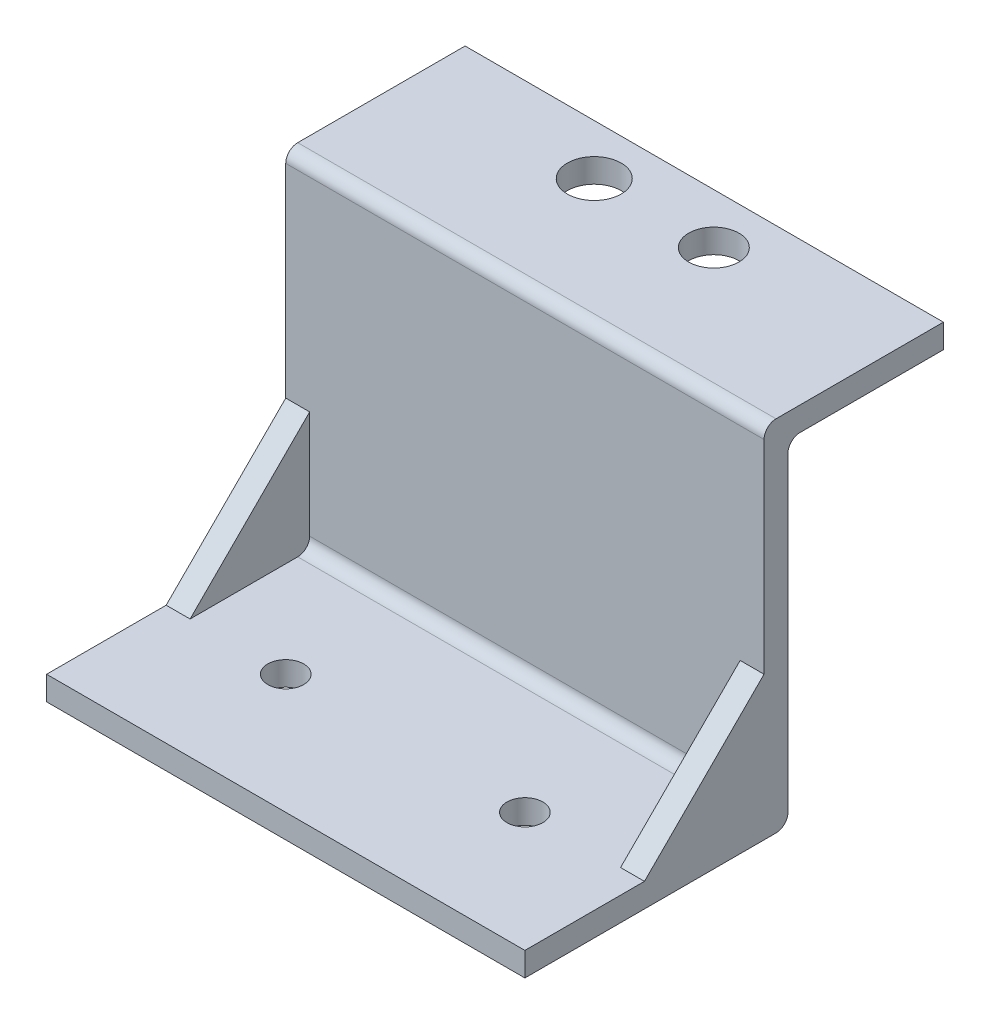
ISO-10303-21;
HEADER;
FILE_DESCRIPTION(('STEP AP214'),'2;1');
FILE_NAME('part.step','',(''),(''),'','','');
FILE_SCHEMA(('AUTOMOTIVE_DESIGN { 1 0 10303 214 1 1 1 1 }'));
ENDSEC;
DATA;
#1=APPLICATION_CONTEXT('core data for automotive mechanical design processes');
#2=APPLICATION_PROTOCOL_DEFINITION('international standard','automotive_design',2000,#1);
#3=PRODUCT_CONTEXT('',#1,'mechanical');
#4=PRODUCT('Part','Part','',(#3));
#5=PRODUCT_RELATED_PRODUCT_CATEGORY('part','',(#4));
#6=PRODUCT_DEFINITION_FORMATION('','',#4);
#7=PRODUCT_DEFINITION_CONTEXT('part definition',#1,'design');
#8=PRODUCT_DEFINITION('design','',#6,#7);
#9=PRODUCT_DEFINITION_SHAPE('','',#8);
#10=(LENGTH_UNIT() NAMED_UNIT(*) SI_UNIT(.MILLI.,.METRE.));
#11=(NAMED_UNIT(*) PLANE_ANGLE_UNIT() SI_UNIT($,.RADIAN.));
#12=(NAMED_UNIT(*) SI_UNIT($,.STERADIAN.) SOLID_ANGLE_UNIT());
#13=UNCERTAINTY_MEASURE_WITH_UNIT(LENGTH_MEASURE(1.E-05),#10,'distance_accuracy_value','');
#14=(GEOMETRIC_REPRESENTATION_CONTEXT(3) GLOBAL_UNCERTAINTY_ASSIGNED_CONTEXT((#13)) GLOBAL_UNIT_ASSIGNED_CONTEXT((#10,
#11,#12)) REPRESENTATION_CONTEXT('',''));
#15=CARTESIAN_POINT('',(0.,0.,0.));
#16=DIRECTION('',(0.,0.,1.));
#17=DIRECTION('',(1.,0.,0.));
#18=AXIS2_PLACEMENT_3D('',#15,#16,#17);
#19=CARTESIAN_POINT('',(0.,-2.,0.));
#20=DIRECTION('',(0.,0.,1.));
#21=DIRECTION('',(1.,0.,0.));
#22=AXIS2_PLACEMENT_3D('',#19,#20,#21);
#23=PLANE('',#22);
#24=DIRECTION('',(1.,0.,0.));
#25=VECTOR('',#24,1.);
#26=CARTESIAN_POINT('',(38.,-18.,0.));
#27=LINE('',#26,#25);
#28=CARTESIAN_POINT('',(38.,-18.,0.));
#29=VERTEX_POINT('',#28);
#30=CARTESIAN_POINT('',(40.,-18.,0.));
#31=VERTEX_POINT('',#30);
#32=EDGE_CURVE('E467',#29,#31,#27,.T.);
#33=ORIENTED_EDGE('',*,*,#32,.T.);
#34=DIRECTION('',(0.,1.,0.));
#35=VECTOR('',#34,1.);
#36=CARTESIAN_POINT('',(40.,-2.,0.));
#37=LINE('',#36,#35);
#38=CARTESIAN_POINT('',(40.,-1.,0.));
#39=VERTEX_POINT('',#38);
#40=EDGE_CURVE('E265',#31,#39,#37,.T.);
#41=ORIENTED_EDGE('',*,*,#40,.T.);
#42=DIRECTION('',(1.,0.,0.));
#43=VECTOR('',#42,1.);
#44=CARTESIAN_POINT('',(0.,-1.,0.));
#45=LINE('',#44,#43);
#46=CARTESIAN_POINT('',(0.,-1.,0.));
#47=VERTEX_POINT('',#46);
#48=EDGE_CURVE('E178',#39,#47,#45,.F.);
#49=ORIENTED_EDGE('',*,*,#48,.T.);
#50=DIRECTION('',(0.,1.,0.));
#51=VECTOR('',#50,1.);
#52=CARTESIAN_POINT('',(0.,-2.,0.));
#53=LINE('',#52,#51);
#54=CARTESIAN_POINT('',(0.,-18.,0.));
#55=VERTEX_POINT('',#54);
#56=EDGE_CURVE('E187',#55,#47,#53,.T.);
#57=ORIENTED_EDGE('',*,*,#56,.F.);
#58=DIRECTION('',(-1.,0.,0.));
#59=VECTOR('',#58,1.);
#60=CARTESIAN_POINT('',(2.,-18.,0.));
#61=LINE('',#60,#59);
#62=CARTESIAN_POINT('',(2.,-18.,0.));
#63=VERTEX_POINT('',#62);
#64=EDGE_CURVE('E485',#63,#55,#61,.T.);
#65=ORIENTED_EDGE('',*,*,#64,.F.);
#66=DIRECTION('',(0.,1.,0.));
#67=VECTOR('',#66,1.);
#68=CARTESIAN_POINT('',(2.,0.,0.));
#69=LINE('',#68,#67);
#70=CARTESIAN_POINT('',(2.,-27.,0.));
#71=VERTEX_POINT('',#70);
#72=EDGE_CURVE('E475',#71,#63,#69,.T.);
#73=ORIENTED_EDGE('',*,*,#72,.F.);
#74=DIRECTION('',(-1.,0.,0.));
#75=VECTOR('',#74,1.);
#76=CARTESIAN_POINT('',(0.,-27.,0.));
#77=LINE('',#76,#75);
#78=CARTESIAN_POINT('',(38.,-27.,0.));
#79=VERTEX_POINT('',#78);
#80=EDGE_CURVE('E182',#71,#79,#77,.F.);
#81=ORIENTED_EDGE('',*,*,#80,.T.);
#82=DIRECTION('',(0.,1.,0.));
#83=VECTOR('',#82,1.);
#84=CARTESIAN_POINT('',(38.,0.,0.));
#85=LINE('',#84,#83);
#86=EDGE_CURVE('E158',#79,#29,#85,.T.);
#87=ORIENTED_EDGE('',*,*,#86,.T.);
#88=EDGE_LOOP('',(#33,#41,#49,#57,#65,#73,#81,#87));
#89=FACE_BOUND('',#88,.T.);
#90=ADVANCED_FACE('F37',(#89),#23,.T.);
#91=CARTESIAN_POINT('',(40.,-28.,20.));
#92=DIRECTION('',(0.,-1.,0.));
#93=DIRECTION('',(1.,0.,0.));
#94=AXIS2_PLACEMENT_3D('',#91,#92,#93);
#95=PLANE('',#94);
#96=CARTESIAN_POINT('',(30.,-28.,10.));
#97=DIRECTION('',(0.,1.,0.));
#98=DIRECTION('',(-1.,0.,0.));
#99=AXIS2_PLACEMENT_3D('',#96,#97,#98);
#100=CIRCLE('',#99,1.5);
#101=CARTESIAN_POINT('',(28.5,-28.,10.));
#102=VERTEX_POINT('',#101);
#103=EDGE_CURVE('E487',#102,#102,#100,.T.);
#104=ORIENTED_EDGE('',*,*,#103,.F.);
#105=EDGE_LOOP('',(#104));
#106=FACE_BOUND('',#105,.T.);
#107=CARTESIAN_POINT('',(10.,-28.,10.));
#108=DIRECTION('',(0.,1.,0.));
#109=DIRECTION('',(-1.,0.,0.));
#110=AXIS2_PLACEMENT_3D('',#107,#108,#109);
#111=CIRCLE('',#110,1.5);
#112=CARTESIAN_POINT('',(8.5,-28.,10.));
#113=VERTEX_POINT('',#112);
#114=EDGE_CURVE('E488',#113,#113,#111,.T.);
#115=ORIENTED_EDGE('',*,*,#114,.F.);
#116=EDGE_LOOP('',(#115));
#117=FACE_BOUND('',#116,.T.);
#118=DIRECTION('',(0.,0.,-1.));
#119=VECTOR('',#118,1.);
#120=CARTESIAN_POINT('',(40.,-28.,20.));
#121=LINE('',#120,#119);
#122=CARTESIAN_POINT('',(40.,-28.,20.));
#123=VERTEX_POINT('',#122);
#124=CARTESIAN_POINT('',(40.,-28.,10.));
#125=VERTEX_POINT('',#124);
#126=EDGE_CURVE('E512',#123,#125,#121,.T.);
#127=ORIENTED_EDGE('',*,*,#126,.T.);
#128=DIRECTION('',(1.,0.,0.));
#129=VECTOR('',#128,1.);
#130=CARTESIAN_POINT('',(38.,-28.,10.));
#131=LINE('',#130,#129);
#132=CARTESIAN_POINT('',(38.,-28.,10.));
#133=VERTEX_POINT('',#132);
#134=EDGE_CURVE('E172',#133,#125,#131,.T.);
#135=ORIENTED_EDGE('',*,*,#134,.F.);
#136=DIRECTION('',(0.,0.,-1.));
#137=VECTOR('',#136,1.);
#138=CARTESIAN_POINT('',(38.,-28.,0.));
#139=LINE('',#138,#137);
#140=CARTESIAN_POINT('',(38.,-28.,1.));
#141=VERTEX_POINT('',#140);
#142=EDGE_CURVE('E155',#133,#141,#139,.T.);
#143=ORIENTED_EDGE('',*,*,#142,.T.);
#144=DIRECTION('',(-1.,0.,0.));
#145=VECTOR('',#144,1.);
#146=CARTESIAN_POINT('',(40.,-28.,1.));
#147=LINE('',#146,#145);
#148=CARTESIAN_POINT('',(2.,-28.,1.));
#149=VERTEX_POINT('',#148);
#150=EDGE_CURVE('E170',#141,#149,#147,.T.);
#151=ORIENTED_EDGE('',*,*,#150,.T.);
#152=DIRECTION('',(0.,0.,-1.));
#153=VECTOR('',#152,1.);
#154=CARTESIAN_POINT('',(2.,-28.,0.));
#155=LINE('',#154,#153);
#156=CARTESIAN_POINT('',(2.,-28.,10.));
#157=VERTEX_POINT('',#156);
#158=EDGE_CURVE('E479',#157,#149,#155,.T.);
#159=ORIENTED_EDGE('',*,*,#158,.F.);
#160=DIRECTION('',(-1.,0.,0.));
#161=VECTOR('',#160,1.);
#162=CARTESIAN_POINT('',(2.,-28.,10.));
#163=LINE('',#162,#161);
#164=CARTESIAN_POINT('',(0.,-28.,10.));
#165=VERTEX_POINT('',#164);
#166=EDGE_CURVE('E481',#157,#165,#163,.T.);
#167=ORIENTED_EDGE('',*,*,#166,.T.);
#168=DIRECTION('',(0.,0.,-1.));
#169=VECTOR('',#168,1.);
#170=CARTESIAN_POINT('',(0.,-28.,20.));
#171=LINE('',#170,#169);
#172=CARTESIAN_POINT('',(0.,-28.,20.));
#173=VERTEX_POINT('',#172);
#174=EDGE_CURVE('E510',#173,#165,#171,.T.);
#175=ORIENTED_EDGE('',*,*,#174,.F.);
#176=DIRECTION('',(-1.,0.,0.));
#177=VECTOR('',#176,1.);
#178=CARTESIAN_POINT('',(40.,-28.,20.));
#179=LINE('',#178,#177);
#180=EDGE_CURVE('E502',#123,#173,#179,.T.);
#181=ORIENTED_EDGE('',*,*,#180,.F.);
#182=EDGE_LOOP('',(#127,#135,#143,#151,#159,#167,#175,#181));
#183=FACE_BOUND('',#182,.T.);
#184=ADVANCED_FACE('F168',(#106,#117,#183),#95,.F.);
#185=CARTESIAN_POINT('',(0.,-2.,0.));
#186=DIRECTION('',(-1.,0.,0.));
#187=DIRECTION('',(0.,0.,1.));
#188=AXIS2_PLACEMENT_3D('',#185,#186,#187);
#189=PLANE('',#188);
#190=DIRECTION('',(0.,-0.707106781186548,0.707106781186548));
#191=VECTOR('',#190,1.);
#192=CARTESIAN_POINT('',(0.,-9.,-9.));
#193=LINE('',#192,#191);
#194=EDGE_CURVE('E270',#55,#165,#193,.T.);
#195=ORIENTED_EDGE('',*,*,#194,.F.);
#196=ORIENTED_EDGE('',*,*,#56,.T.);
#197=CARTESIAN_POINT('',(0.,-1.,-1.));
#198=DIRECTION('',(-1.,0.,0.));
#199=DIRECTION('',(0.,0.,1.));
#200=AXIS2_PLACEMENT_3D('',#197,#198,#199);
#201=CIRCLE('',#200,1.);
#202=CARTESIAN_POINT('',(0.,0.,-1.));
#203=VERTEX_POINT('',#202);
#204=EDGE_CURVE('E60',#47,#203,#201,.T.);
#205=ORIENTED_EDGE('',*,*,#204,.T.);
#206=DIRECTION('',(0.,0.,1.));
#207=VECTOR('',#206,1.);
#208=CARTESIAN_POINT('',(0.,0.,0.));
#209=LINE('',#208,#207);
#210=CARTESIAN_POINT('',(0.,0.,-15.));
#211=VERTEX_POINT('',#210);
#212=EDGE_CURVE('E254',#211,#203,#209,.T.);
#213=ORIENTED_EDGE('',*,*,#212,.F.);
#214=DIRECTION('',(0.,1.,0.));
#215=VECTOR('',#214,1.);
#216=CARTESIAN_POINT('',(0.,-2.,-15.));
#217=LINE('',#216,#215);
#218=CARTESIAN_POINT('',(0.,-2.,-15.));
#219=VERTEX_POINT('',#218);
#220=EDGE_CURVE('E179',#219,#211,#217,.T.);
#221=ORIENTED_EDGE('',*,*,#220,.F.);
#222=DIRECTION('',(0.,0.,1.));
#223=VECTOR('',#222,1.);
#224=CARTESIAN_POINT('',(0.,-2.,0.));
#225=LINE('',#224,#223);
#226=CARTESIAN_POINT('',(0.,-2.,-3.00000000000001));
#227=VERTEX_POINT('',#226);
#228=EDGE_CURVE('E226',#219,#227,#225,.T.);
#229=ORIENTED_EDGE('',*,*,#228,.T.);
#230=CARTESIAN_POINT('',(0.,-3.,-3.00000000000001));
#231=DIRECTION('',(-1.,0.,0.));
#232=DIRECTION('',(0.,0.,1.));
#233=AXIS2_PLACEMENT_3D('',#230,#231,#232);
#234=CIRCLE('',#233,1.);
#235=CARTESIAN_POINT('',(0.,-3.,-2.00000000000001));
#236=VERTEX_POINT('',#235);
#237=EDGE_CURVE('E11',#227,#236,#234,.F.);
#238=ORIENTED_EDGE('',*,*,#237,.T.);
#239=DIRECTION('',(0.,1.,0.));
#240=VECTOR('',#239,1.);
#241=CARTESIAN_POINT('',(0.,-30.,-2.00000000000001));
#242=LINE('',#241,#240);
#243=CARTESIAN_POINT('',(0.,-29.,-2.00000000000001));
#244=VERTEX_POINT('',#243);
#245=EDGE_CURVE('E234',#244,#236,#242,.T.);
#246=ORIENTED_EDGE('',*,*,#245,.F.);
#247=CARTESIAN_POINT('',(0.,-29.,-1.00000000000001));
#248=DIRECTION('',(-1.,0.,0.));
#249=DIRECTION('',(0.,0.,1.));
#250=AXIS2_PLACEMENT_3D('',#247,#248,#249);
#251=CIRCLE('',#250,1.);
#252=CARTESIAN_POINT('',(0.,-30.,-1.00000000000001));
#253=VERTEX_POINT('',#252);
#254=EDGE_CURVE('E205',#244,#253,#251,.T.);
#255=ORIENTED_EDGE('',*,*,#254,.T.);
#256=DIRECTION('',(0.,0.,-1.));
#257=VECTOR('',#256,1.);
#258=CARTESIAN_POINT('',(0.,-30.,0.));
#259=LINE('',#258,#257);
#260=CARTESIAN_POINT('',(0.,-30.,20.));
#261=VERTEX_POINT('',#260);
#262=EDGE_CURVE('E244',#261,#253,#259,.T.);
#263=ORIENTED_EDGE('',*,*,#262,.F.);
#264=DIRECTION('',(0.,-1.,0.));
#265=VECTOR('',#264,1.);
#266=CARTESIAN_POINT('',(0.,-30.,20.));
#267=LINE('',#266,#265);
#268=EDGE_CURVE('E504',#173,#261,#267,.T.);
#269=ORIENTED_EDGE('',*,*,#268,.F.);
#270=ORIENTED_EDGE('',*,*,#174,.T.);
#271=EDGE_LOOP('',(#195,#196,#205,#213,#221,#229,#238,#246,#255,#263,#269,#270));
#272=FACE_BOUND('',#271,.T.);
#273=ADVANCED_FACE('F233',(#272),#189,.T.);
#274=CARTESIAN_POINT('',(0.,-2.,-15.));
#275=DIRECTION('',(0.,0.,-1.));
#276=DIRECTION('',(-1.,0.,0.));
#277=AXIS2_PLACEMENT_3D('',#274,#275,#276);
#278=PLANE('',#277);
#279=DIRECTION('',(-1.,0.,0.));
#280=VECTOR('',#279,1.);
#281=CARTESIAN_POINT('',(0.,0.,-15.));
#282=LINE('',#281,#280);
#283=CARTESIAN_POINT('',(40.,0.,-15.));
#284=VERTEX_POINT('',#283);
#285=EDGE_CURVE('E257',#284,#211,#282,.T.);
#286=ORIENTED_EDGE('',*,*,#285,.F.);
#287=DIRECTION('',(0.,1.,0.));
#288=VECTOR('',#287,1.);
#289=CARTESIAN_POINT('',(40.,-2.,-15.));
#290=LINE('',#289,#288);
#291=CARTESIAN_POINT('',(40.,-2.,-15.));
#292=VERTEX_POINT('',#291);
#293=EDGE_CURVE('E184',#292,#284,#290,.T.);
#294=ORIENTED_EDGE('',*,*,#293,.F.);
#295=DIRECTION('',(-1.,0.,0.));
#296=VECTOR('',#295,1.);
#297=CARTESIAN_POINT('',(0.,-2.,-15.));
#298=LINE('',#297,#296);
#299=EDGE_CURVE('E225',#292,#219,#298,.T.);
#300=ORIENTED_EDGE('',*,*,#299,.T.);
#301=ORIENTED_EDGE('',*,*,#220,.T.);
#302=EDGE_LOOP('',(#286,#294,#300,#301));
#303=FACE_BOUND('',#302,.T.);
#304=ADVANCED_FACE('F280',(#303),#278,.T.);
#305=CARTESIAN_POINT('',(40.,-2.,0.));
#306=DIRECTION('',(1.,0.,0.));
#307=DIRECTION('',(0.,0.,-1.));
#308=AXIS2_PLACEMENT_3D('',#305,#306,#307);
#309=PLANE('',#308);
#310=ORIENTED_EDGE('',*,*,#40,.F.);
#311=DIRECTION('',(0.,-0.707106781186548,0.707106781186548));
#312=VECTOR('',#311,1.);
#313=CARTESIAN_POINT('',(40.,-9.,-9.));
#314=LINE('',#313,#312);
#315=EDGE_CURVE('E163',#31,#125,#314,.T.);
#316=ORIENTED_EDGE('',*,*,#315,.T.);
#317=ORIENTED_EDGE('',*,*,#126,.F.);
#318=DIRECTION('',(0.,1.,0.));
#319=VECTOR('',#318,1.);
#320=CARTESIAN_POINT('',(40.,-30.,20.));
#321=LINE('',#320,#319);
#322=CARTESIAN_POINT('',(40.,-30.,20.));
#323=VERTEX_POINT('',#322);
#324=EDGE_CURVE('E499',#323,#123,#321,.T.);
#325=ORIENTED_EDGE('',*,*,#324,.F.);
#326=DIRECTION('',(0.,0.,1.));
#327=VECTOR('',#326,1.);
#328=CARTESIAN_POINT('',(40.,-30.,0.));
#329=LINE('',#328,#327);
#330=CARTESIAN_POINT('',(40.,-30.,-1.));
#331=VERTEX_POINT('',#330);
#332=EDGE_CURVE('E514',#331,#323,#329,.T.);
#333=ORIENTED_EDGE('',*,*,#332,.F.);
#334=CARTESIAN_POINT('',(40.,-29.,-1.));
#335=DIRECTION('',(1.,0.,0.));
#336=DIRECTION('',(0.,0.,-1.));
#337=AXIS2_PLACEMENT_3D('',#334,#335,#336);
#338=CIRCLE('',#337,1.);
#339=CARTESIAN_POINT('',(40.,-29.,-2.));
#340=VERTEX_POINT('',#339);
#341=EDGE_CURVE('E197',#331,#340,#338,.T.);
#342=ORIENTED_EDGE('',*,*,#341,.T.);
#343=DIRECTION('',(0.,1.,0.));
#344=VECTOR('',#343,1.);
#345=CARTESIAN_POINT('',(40.,-30.,-2.));
#346=LINE('',#345,#344);
#347=CARTESIAN_POINT('',(40.,-3.,-2.));
#348=VERTEX_POINT('',#347);
#349=EDGE_CURVE('E218',#340,#348,#346,.T.);
#350=ORIENTED_EDGE('',*,*,#349,.T.);
#351=CARTESIAN_POINT('',(40.,-3.,-3.));
#352=DIRECTION('',(1.,0.,0.));
#353=DIRECTION('',(0.,0.,-1.));
#354=AXIS2_PLACEMENT_3D('',#351,#352,#353);
#355=CIRCLE('',#354,1.);
#356=CARTESIAN_POINT('',(40.,-2.,-3.));
#357=VERTEX_POINT('',#356);
#358=EDGE_CURVE('E45',#348,#357,#355,.F.);
#359=ORIENTED_EDGE('',*,*,#358,.T.);
#360=DIRECTION('',(0.,0.,-1.));
#361=VECTOR('',#360,1.);
#362=CARTESIAN_POINT('',(40.,-2.,0.));
#363=LINE('',#362,#361);
#364=EDGE_CURVE('E215',#357,#292,#363,.T.);
#365=ORIENTED_EDGE('',*,*,#364,.T.);
#366=ORIENTED_EDGE('',*,*,#293,.T.);
#367=DIRECTION('',(0.,0.,-1.));
#368=VECTOR('',#367,1.);
#369=CARTESIAN_POINT('',(40.,0.,0.));
#370=LINE('',#369,#368);
#371=CARTESIAN_POINT('',(40.,0.,-1.));
#372=VERTEX_POINT('',#371);
#373=EDGE_CURVE('E261',#372,#284,#370,.T.);
#374=ORIENTED_EDGE('',*,*,#373,.F.);
#375=CARTESIAN_POINT('',(40.,-1.,-1.));
#376=DIRECTION('',(1.,0.,0.));
#377=DIRECTION('',(0.,0.,-1.));
#378=AXIS2_PLACEMENT_3D('',#375,#376,#377);
#379=CIRCLE('',#378,1.);
#380=EDGE_CURVE('E194',#372,#39,#379,.T.);
#381=ORIENTED_EDGE('',*,*,#380,.T.);
#382=EDGE_LOOP('',(#310,#316,#317,#325,#333,#342,#350,#359,#365,#366,#374,#381));
#383=FACE_BOUND('',#382,.T.);
#384=ADVANCED_FACE('F213',(#383),#309,.T.);
#385=CARTESIAN_POINT('',(0.,-2.,0.));
#386=DIRECTION('',(0.,-1.,0.));
#387=DIRECTION('',(0.,0.,-1.));
#388=AXIS2_PLACEMENT_3D('',#385,#386,#387);
#389=PLANE('',#388);
#390=ORIENTED_EDGE('',*,*,#364,.F.);
#391=DIRECTION('',(1.,0.,0.));
#392=VECTOR('',#391,1.);
#393=CARTESIAN_POINT('',(0.,-2.,-3.00000000000001));
#394=LINE('',#393,#392);
#395=EDGE_CURVE('E52',#357,#227,#394,.F.);
#396=ORIENTED_EDGE('',*,*,#395,.T.);
#397=ORIENTED_EDGE('',*,*,#228,.F.);
#398=ORIENTED_EDGE('',*,*,#299,.F.);
#399=EDGE_LOOP('',(#390,#396,#397,#398));
#400=FACE_BOUND('',#399,.T.);
#401=CARTESIAN_POINT('',(25.,-2.,-10.8));
#402=DIRECTION('',(0.,1.,0.));
#403=DIRECTION('',(0.,0.,1.));
#404=AXIS2_PLACEMENT_3D('',#401,#402,#403);
#405=CIRCLE('',#404,2.1);
#406=CARTESIAN_POINT('',(25.,-2.,-8.7));
#407=VERTEX_POINT('',#406);
#408=EDGE_CURVE('E242',#407,#407,#405,.T.);
#409=ORIENTED_EDGE('',*,*,#408,.T.);
#410=EDGE_LOOP('',(#409));
#411=FACE_BOUND('',#410,.T.);
#412=CARTESIAN_POINT('',(15.,-2.,-10.8));
#413=DIRECTION('',(0.,1.,0.));
#414=DIRECTION('',(0.,0.,1.));
#415=AXIS2_PLACEMENT_3D('',#412,#413,#414);
#416=CIRCLE('',#415,2.25);
#417=CARTESIAN_POINT('',(15.,-2.,-8.55));
#418=VERTEX_POINT('',#417);
#419=EDGE_CURVE('E251',#418,#418,#416,.T.);
#420=ORIENTED_EDGE('',*,*,#419,.T.);
#421=EDGE_LOOP('',(#420));
#422=FACE_BOUND('',#421,.T.);
#423=ADVANCED_FACE('F222',(#400,#411,#422),#389,.T.);
#424=CARTESIAN_POINT('',(0.,0.,0.));
#425=DIRECTION('',(0.,-1.,0.));
#426=DIRECTION('',(0.,0.,-1.));
#427=AXIS2_PLACEMENT_3D('',#424,#425,#426);
#428=PLANE('',#427);
#429=CARTESIAN_POINT('',(25.,0.,-10.8));
#430=DIRECTION('',(0.,1.,0.));
#431=DIRECTION('',(0.,0.,1.));
#432=AXIS2_PLACEMENT_3D('',#429,#430,#431);
#433=CIRCLE('',#432,2.1);
#434=CARTESIAN_POINT('',(25.,0.,-8.7));
#435=VERTEX_POINT('',#434);
#436=EDGE_CURVE('E239',#435,#435,#433,.T.);
#437=ORIENTED_EDGE('',*,*,#436,.F.);
#438=EDGE_LOOP('',(#437));
#439=FACE_BOUND('',#438,.T.);
#440=CARTESIAN_POINT('',(15.,0.,-10.8));
#441=DIRECTION('',(0.,1.,0.));
#442=DIRECTION('',(0.,0.,1.));
#443=AXIS2_PLACEMENT_3D('',#440,#441,#442);
#444=CIRCLE('',#443,2.25);
#445=CARTESIAN_POINT('',(15.,0.,-8.55));
#446=VERTEX_POINT('',#445);
#447=EDGE_CURVE('E249',#446,#446,#444,.T.);
#448=ORIENTED_EDGE('',*,*,#447,.F.);
#449=EDGE_LOOP('',(#448));
#450=FACE_BOUND('',#449,.T.);
#451=ORIENTED_EDGE('',*,*,#212,.T.);
#452=DIRECTION('',(1.,0.,0.));
#453=VECTOR('',#452,1.);
#454=CARTESIAN_POINT('',(40.,0.,-1.));
#455=LINE('',#454,#453);
#456=EDGE_CURVE('E208',#203,#372,#455,.T.);
#457=ORIENTED_EDGE('',*,*,#456,.T.);
#458=ORIENTED_EDGE('',*,*,#373,.T.);
#459=ORIENTED_EDGE('',*,*,#285,.T.);
#460=EDGE_LOOP('',(#451,#457,#458,#459));
#461=FACE_BOUND('',#460,.T.);
#462=ADVANCED_FACE('F277',(#439,#450,#461),#428,.F.);
#463=CARTESIAN_POINT('',(15.,-2.,-10.8));
#464=DIRECTION('',(0.,1.,0.));
#465=DIRECTION('',(0.,0.,1.));
#466=AXIS2_PLACEMENT_3D('',#463,#464,#465);
#467=CYLINDRICAL_SURFACE('',#466,2.25);
#468=ORIENTED_EDGE('',*,*,#419,.F.);
#469=EDGE_LOOP('',(#468));
#470=FACE_BOUND('',#469,.T.);
#471=ORIENTED_EDGE('',*,*,#447,.T.);
#472=EDGE_LOOP('',(#471));
#473=FACE_BOUND('',#472,.T.);
#474=ADVANCED_FACE('F343',(#470,#473),#467,.F.);
#475=CARTESIAN_POINT('',(25.,-2.,-10.8));
#476=DIRECTION('',(0.,1.,0.));
#477=DIRECTION('',(0.,0.,1.));
#478=AXIS2_PLACEMENT_3D('',#475,#476,#477);
#479=CYLINDRICAL_SURFACE('',#478,2.1);
#480=ORIENTED_EDGE('',*,*,#408,.F.);
#481=EDGE_LOOP('',(#480));
#482=FACE_BOUND('',#481,.T.);
#483=ORIENTED_EDGE('',*,*,#436,.T.);
#484=EDGE_LOOP('',(#483));
#485=FACE_BOUND('',#484,.T.);
#486=ADVANCED_FACE('F340',(#482,#485),#479,.F.);
#487=CARTESIAN_POINT('',(40.,-30.,-2.));
#488=DIRECTION('',(0.,0.,1.));
#489=DIRECTION('',(1.,0.,0.));
#490=AXIS2_PLACEMENT_3D('',#487,#488,#489);
#491=PLANE('',#490);
#492=ORIENTED_EDGE('',*,*,#349,.F.);
#493=DIRECTION('',(1.,0.,0.));
#494=VECTOR('',#493,1.);
#495=CARTESIAN_POINT('',(40.,-29.,-2.));
#496=LINE('',#495,#494);
#497=EDGE_CURVE('E202',#340,#244,#496,.F.);
#498=ORIENTED_EDGE('',*,*,#497,.T.);
#499=ORIENTED_EDGE('',*,*,#245,.T.);
#500=DIRECTION('',(1.,0.,0.));
#501=VECTOR('',#500,1.);
#502=CARTESIAN_POINT('',(40.,-3.,-2.));
#503=LINE('',#502,#501);
#504=EDGE_CURVE('E199',#236,#348,#503,.T.);
#505=ORIENTED_EDGE('',*,*,#504,.T.);
#506=EDGE_LOOP('',(#492,#498,#499,#505));
#507=FACE_BOUND('',#506,.T.);
#508=ADVANCED_FACE('F237',(#507),#491,.F.);
#509=CARTESIAN_POINT('',(0.,-30.,0.));
#510=DIRECTION('',(0.,1.,0.));
#511=DIRECTION('',(0.,0.,1.));
#512=AXIS2_PLACEMENT_3D('',#509,#510,#511);
#513=PLANE('',#512);
#514=CARTESIAN_POINT('',(10.,-30.,10.));
#515=DIRECTION('',(0.,1.,0.));
#516=DIRECTION('',(0.,0.,1.));
#517=AXIS2_PLACEMENT_3D('',#514,#515,#516);
#518=CIRCLE('',#517,1.5);
#519=CARTESIAN_POINT('',(10.,-30.,11.5));
#520=VERTEX_POINT('',#519);
#521=EDGE_CURVE('E496',#520,#520,#518,.T.);
#522=ORIENTED_EDGE('',*,*,#521,.T.);
#523=EDGE_LOOP('',(#522));
#524=FACE_BOUND('',#523,.T.);
#525=CARTESIAN_POINT('',(30.,-30.,10.));
#526=DIRECTION('',(0.,1.,0.));
#527=DIRECTION('',(0.,0.,1.));
#528=AXIS2_PLACEMENT_3D('',#525,#526,#527);
#529=CIRCLE('',#528,1.5);
#530=CARTESIAN_POINT('',(30.,-30.,11.5));
#531=VERTEX_POINT('',#530);
#532=EDGE_CURVE('E491',#531,#531,#529,.T.);
#533=ORIENTED_EDGE('',*,*,#532,.T.);
#534=EDGE_LOOP('',(#533));
#535=FACE_BOUND('',#534,.T.);
#536=ORIENTED_EDGE('',*,*,#262,.T.);
#537=DIRECTION('',(1.,0.,0.));
#538=VECTOR('',#537,1.);
#539=CARTESIAN_POINT('',(0.,-30.,-1.00000000000001));
#540=LINE('',#539,#538);
#541=EDGE_CURVE('E191',#253,#331,#540,.T.);
#542=ORIENTED_EDGE('',*,*,#541,.T.);
#543=ORIENTED_EDGE('',*,*,#332,.T.);
#544=DIRECTION('',(1.,0.,0.));
#545=VECTOR('',#544,1.);
#546=CARTESIAN_POINT('',(40.,-30.,20.));
#547=LINE('',#546,#545);
#548=EDGE_CURVE('E507',#261,#323,#547,.T.);
#549=ORIENTED_EDGE('',*,*,#548,.F.);
#550=EDGE_LOOP('',(#536,#542,#543,#549));
#551=FACE_BOUND('',#550,.T.);
#552=ADVANCED_FACE('F332',(#524,#535,#551),#513,.F.);
#553=CARTESIAN_POINT('',(0.,0.,20.));
#554=DIRECTION('',(0.,0.,1.));
#555=DIRECTION('',(1.,0.,0.));
#556=AXIS2_PLACEMENT_3D('',#553,#554,#555);
#557=PLANE('',#556);
#558=ORIENTED_EDGE('',*,*,#324,.T.);
#559=ORIENTED_EDGE('',*,*,#180,.T.);
#560=ORIENTED_EDGE('',*,*,#268,.T.);
#561=ORIENTED_EDGE('',*,*,#548,.T.);
#562=EDGE_LOOP('',(#558,#559,#560,#561));
#563=FACE_BOUND('',#562,.T.);
#564=ADVANCED_FACE('F329',(#563),#557,.T.);
#565=CARTESIAN_POINT('',(30.,-48.,10.));
#566=DIRECTION('',(0.,1.,0.));
#567=DIRECTION('',(-1.,0.,0.));
#568=AXIS2_PLACEMENT_3D('',#565,#566,#567);
#569=CYLINDRICAL_SURFACE('',#568,1.5);
#570=ORIENTED_EDGE('',*,*,#103,.T.);
#571=EDGE_LOOP('',(#570));
#572=FACE_BOUND('',#571,.T.);
#573=ORIENTED_EDGE('',*,*,#532,.F.);
#574=EDGE_LOOP('',(#573));
#575=FACE_BOUND('',#574,.T.);
#576=ADVANCED_FACE('F325',(#572,#575),#569,.F.);
#577=CARTESIAN_POINT('',(10.,-48.,10.));
#578=DIRECTION('',(0.,1.,0.));
#579=DIRECTION('',(-1.,0.,0.));
#580=AXIS2_PLACEMENT_3D('',#577,#578,#579);
#581=CYLINDRICAL_SURFACE('',#580,1.5);
#582=ORIENTED_EDGE('',*,*,#114,.T.);
#583=EDGE_LOOP('',(#582));
#584=FACE_BOUND('',#583,.T.);
#585=ORIENTED_EDGE('',*,*,#521,.F.);
#586=EDGE_LOOP('',(#585));
#587=FACE_BOUND('',#586,.T.);
#588=ADVANCED_FACE('F301',(#584,#587),#581,.F.);
#589=CARTESIAN_POINT('',(40.,-27.,1.));
#590=DIRECTION('',(-1.,0.,0.));
#591=DIRECTION('',(0.,-1.,0.));
#592=AXIS2_PLACEMENT_3D('',#589,#590,#591);
#593=CYLINDRICAL_SURFACE('',#592,1.);
#594=ORIENTED_EDGE('',*,*,#150,.F.);
#595=CARTESIAN_POINT('',(38.,-27.,1.));
#596=DIRECTION('',(1.,0.,0.));
#597=DIRECTION('',(0.,0.,-1.));
#598=AXIS2_PLACEMENT_3D('',#595,#596,#597);
#599=CIRCLE('',#598,1.);
#600=EDGE_CURVE('E151',#141,#79,#599,.T.);
#601=ORIENTED_EDGE('',*,*,#600,.T.);
#602=ORIENTED_EDGE('',*,*,#80,.F.);
#603=CARTESIAN_POINT('',(2.,-27.,1.));
#604=DIRECTION('',(1.,0.,0.));
#605=DIRECTION('',(0.,0.,-1.));
#606=AXIS2_PLACEMENT_3D('',#603,#604,#605);
#607=CIRCLE('',#606,1.);
#608=EDGE_CURVE('E177',#149,#71,#607,.T.);
#609=ORIENTED_EDGE('',*,*,#608,.F.);
#610=EDGE_LOOP('',(#594,#601,#602,#609));
#611=FACE_BOUND('',#610,.T.);
#612=ADVANCED_FACE('F176',(#611),#593,.F.);
#613=CARTESIAN_POINT('',(0.,-29.,-1.00000000000001));
#614=DIRECTION('',(1.,0.,0.));
#615=DIRECTION('',(0.,0.,-1.));
#616=AXIS2_PLACEMENT_3D('',#613,#614,#615);
#617=CYLINDRICAL_SURFACE('',#616,1.);
#618=ORIENTED_EDGE('',*,*,#254,.F.);
#619=ORIENTED_EDGE('',*,*,#497,.F.);
#620=ORIENTED_EDGE('',*,*,#341,.F.);
#621=ORIENTED_EDGE('',*,*,#541,.F.);
#622=EDGE_LOOP('',(#618,#619,#620,#621));
#623=FACE_BOUND('',#622,.T.);
#624=ADVANCED_FACE('F300',(#623),#617,.T.);
#625=CARTESIAN_POINT('',(40.,-3.,-3.));
#626=DIRECTION('',(1.,0.,0.));
#627=DIRECTION('',(0.,0.,-1.));
#628=AXIS2_PLACEMENT_3D('',#625,#626,#627);
#629=CYLINDRICAL_SURFACE('',#628,1.);
#630=ORIENTED_EDGE('',*,*,#237,.F.);
#631=ORIENTED_EDGE('',*,*,#395,.F.);
#632=ORIENTED_EDGE('',*,*,#358,.F.);
#633=ORIENTED_EDGE('',*,*,#504,.F.);
#634=EDGE_LOOP('',(#630,#631,#632,#633));
#635=FACE_BOUND('',#634,.T.);
#636=ADVANCED_FACE('F229',(#635),#629,.F.);
#637=CARTESIAN_POINT('',(0.,-1.,-1.));
#638=DIRECTION('',(-1.,0.,0.));
#639=DIRECTION('',(0.,0.,1.));
#640=AXIS2_PLACEMENT_3D('',#637,#638,#639);
#641=CYLINDRICAL_SURFACE('',#640,1.);
#642=ORIENTED_EDGE('',*,*,#204,.F.);
#643=ORIENTED_EDGE('',*,*,#48,.F.);
#644=ORIENTED_EDGE('',*,*,#380,.F.);
#645=ORIENTED_EDGE('',*,*,#456,.F.);
#646=EDGE_LOOP('',(#642,#643,#644,#645));
#647=FACE_BOUND('',#646,.T.);
#648=ADVANCED_FACE('F39',(#647),#641,.T.);
#649=CARTESIAN_POINT('',(2.,-9.,-9.));
#650=DIRECTION('',(0.,-0.707106781186547,-0.707106781186547));
#651=DIRECTION('',(0.,0.707106781186548,-0.707106781186548));
#652=AXIS2_PLACEMENT_3D('',#649,#650,#651);
#653=PLANE('',#652);
#654=ORIENTED_EDGE('',*,*,#194,.T.);
#655=ORIENTED_EDGE('',*,*,#166,.F.);
#656=DIRECTION('',(0.,-0.707106781186548,0.707106781186548));
#657=VECTOR('',#656,1.);
#658=CARTESIAN_POINT('',(2.,-9.,-9.));
#659=LINE('',#658,#657);
#660=EDGE_CURVE('E477',#63,#157,#659,.T.);
#661=ORIENTED_EDGE('',*,*,#660,.F.);
#662=ORIENTED_EDGE('',*,*,#64,.T.);
#663=EDGE_LOOP('',(#654,#655,#661,#662));
#664=FACE_BOUND('',#663,.T.);
#665=ADVANCED_FACE('F308',(#664),#653,.F.);
#666=CARTESIAN_POINT('',(2.,0.,0.));
#667=DIRECTION('',(1.,0.,0.));
#668=DIRECTION('',(0.,0.,-1.));
#669=AXIS2_PLACEMENT_3D('',#666,#667,#668);
#670=PLANE('',#669);
#671=ORIENTED_EDGE('',*,*,#608,.T.);
#672=ORIENTED_EDGE('',*,*,#72,.T.);
#673=ORIENTED_EDGE('',*,*,#660,.T.);
#674=ORIENTED_EDGE('',*,*,#158,.T.);
#675=EDGE_LOOP('',(#671,#672,#673,#674));
#676=FACE_BOUND('',#675,.T.);
#677=ADVANCED_FACE('F312',(#676),#670,.T.);
#678=CARTESIAN_POINT('',(38.,-9.,-9.));
#679=DIRECTION('',(0.,0.707106781186547,0.707106781186547));
#680=DIRECTION('',(0.,-0.707106781186548,0.707106781186548));
#681=AXIS2_PLACEMENT_3D('',#678,#679,#680);
#682=PLANE('',#681);
#683=ORIENTED_EDGE('',*,*,#315,.F.);
#684=ORIENTED_EDGE('',*,*,#32,.F.);
#685=DIRECTION('',(0.,-0.707106781186548,0.707106781186548));
#686=VECTOR('',#685,1.);
#687=CARTESIAN_POINT('',(38.,-9.,-9.));
#688=LINE('',#687,#686);
#689=EDGE_CURVE('E173',#29,#133,#688,.T.);
#690=ORIENTED_EDGE('',*,*,#689,.T.);
#691=ORIENTED_EDGE('',*,*,#134,.T.);
#692=EDGE_LOOP('',(#683,#684,#690,#691));
#693=FACE_BOUND('',#692,.T.);
#694=ADVANCED_FACE('F318',(#693),#682,.T.);
#695=CARTESIAN_POINT('',(38.,0.,0.));
#696=DIRECTION('',(-1.,0.,0.));
#697=DIRECTION('',(0.,0.,-1.));
#698=AXIS2_PLACEMENT_3D('',#695,#696,#697);
#699=PLANE('',#698);
#700=ORIENTED_EDGE('',*,*,#600,.F.);
#701=ORIENTED_EDGE('',*,*,#142,.F.);
#702=ORIENTED_EDGE('',*,*,#689,.F.);
#703=ORIENTED_EDGE('',*,*,#86,.F.);
#704=EDGE_LOOP('',(#700,#701,#702,#703));
#705=FACE_BOUND('',#704,.T.);
#706=ADVANCED_FACE('F153',(#705),#699,.T.);
#707=CLOSED_SHELL('',(#90,#184,#273,#304,#384,#423,#462,#474,#486,#508,#552,#564,#576,#588,#612,
#624,#636,#648,#665,#677,#694,#706));
#708=MANIFOLD_SOLID_BREP('B2',#707);
#709=ADVANCED_BREP_SHAPE_REPRESENTATION('',(#18,#708),#14);
#710=SHAPE_DEFINITION_REPRESENTATION(#9,#709);
ENDSEC;
END-ISO-10303-21;
